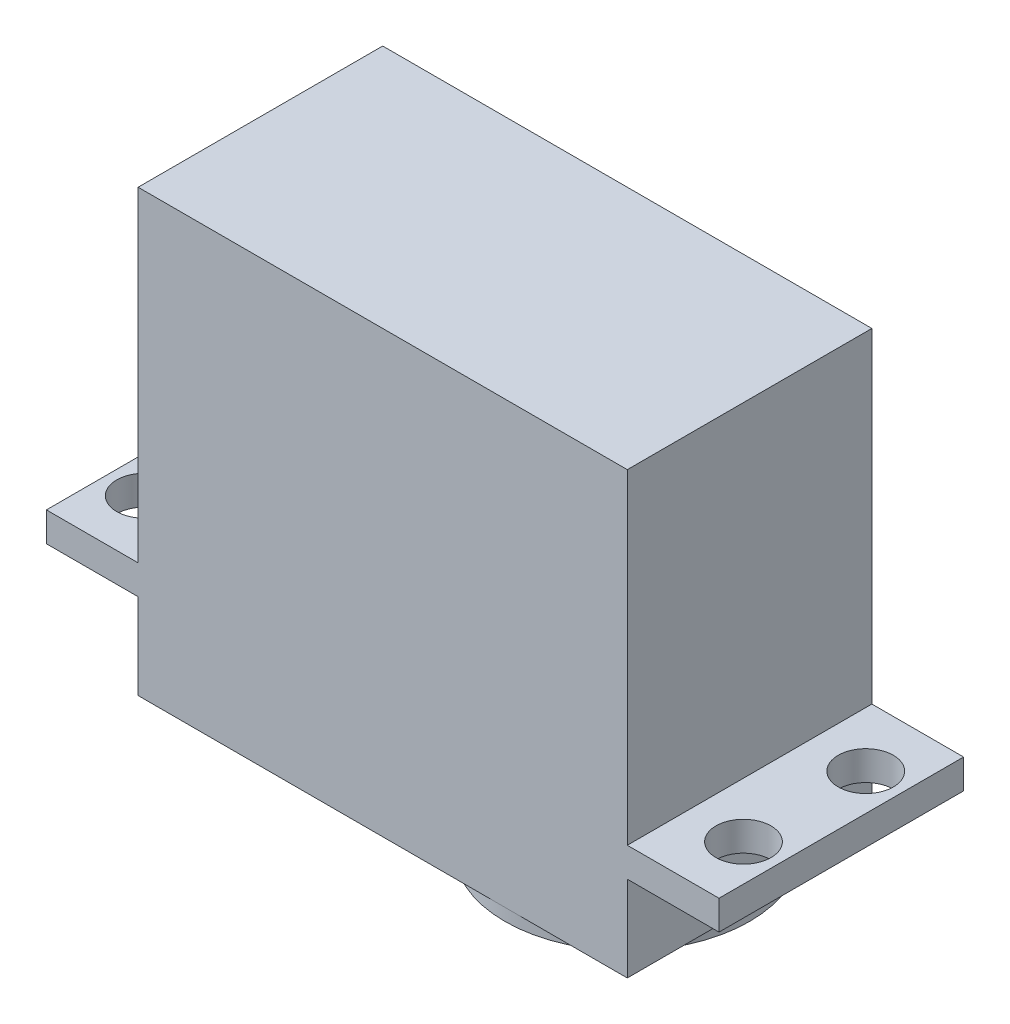
ISO-10303-21;
HEADER;
FILE_DESCRIPTION(('STEP AP214'),'2;1');
FILE_NAME('part.step','',(''),(''),'','','');
FILE_SCHEMA(('AUTOMOTIVE_DESIGN { 1 0 10303 214 1 1 1 1 }'));
ENDSEC;
DATA;
#1=APPLICATION_CONTEXT('core data for automotive mechanical design processes');
#2=APPLICATION_PROTOCOL_DEFINITION('international standard','automotive_design',2000,#1);
#3=PRODUCT_CONTEXT('',#1,'mechanical');
#4=PRODUCT('Part','Part','',(#3));
#5=PRODUCT_RELATED_PRODUCT_CATEGORY('part','',(#4));
#6=PRODUCT_DEFINITION_FORMATION('','',#4);
#7=PRODUCT_DEFINITION_CONTEXT('part definition',#1,'design');
#8=PRODUCT_DEFINITION('design','',#6,#7);
#9=PRODUCT_DEFINITION_SHAPE('','',#8);
#10=(LENGTH_UNIT() NAMED_UNIT(*) SI_UNIT(.MILLI.,.METRE.));
#11=(NAMED_UNIT(*) PLANE_ANGLE_UNIT() SI_UNIT($,.RADIAN.));
#12=(NAMED_UNIT(*) SI_UNIT($,.STERADIAN.) SOLID_ANGLE_UNIT());
#13=UNCERTAINTY_MEASURE_WITH_UNIT(LENGTH_MEASURE(1.E-05),#10,'distance_accuracy_value','');
#14=(GEOMETRIC_REPRESENTATION_CONTEXT(3) GLOBAL_UNCERTAINTY_ASSIGNED_CONTEXT((#13)) GLOBAL_UNIT_ASSIGNED_CONTEXT((#10,
#11,#12)) REPRESENTATION_CONTEXT('',''));
#15=CARTESIAN_POINT('',(0.,0.,0.));
#16=DIRECTION('',(0.,0.,1.));
#17=DIRECTION('',(1.,0.,0.));
#18=AXIS2_PLACEMENT_3D('',#15,#16,#17);
#19=CARTESIAN_POINT('',(0.,0.,0.));
#20=DIRECTION('',(0.,-1.,0.));
#21=DIRECTION('',(0.,0.,-1.));
#22=AXIS2_PLACEMENT_3D('',#19,#20,#21);
#23=PLANE('',#22);
#24=CARTESIAN_POINT('',(10.,0.,0.));
#25=DIRECTION('',(0.,-1.,0.));
#26=DIRECTION('',(0.,0.,-1.));
#27=AXIS2_PLACEMENT_3D('',#24,#25,#26);
#28=CIRCLE('',#27,10.);
#29=CARTESIAN_POINT('',(10.,0.,-10.));
#30=VERTEX_POINT('',#29);
#31=CARTESIAN_POINT('',(20.,0.,0.));
#32=VERTEX_POINT('',#31);
#33=EDGE_CURVE('E43',#30,#32,#28,.T.);
#34=ORIENTED_EDGE('',*,*,#33,.F.);
#35=DIRECTION('',(-1.,0.,0.));
#36=VECTOR('',#35,1.);
#37=CARTESIAN_POINT('',(-20.,0.,-10.));
#38=LINE('',#37,#36);
#39=CARTESIAN_POINT('',(20.,0.,-10.));
#40=VERTEX_POINT('',#39);
#41=EDGE_CURVE('E133',#40,#30,#38,.T.);
#42=ORIENTED_EDGE('',*,*,#41,.F.);
#43=DIRECTION('',(0.,0.,-1.));
#44=VECTOR('',#43,1.);
#45=CARTESIAN_POINT('',(20.,0.,10.));
#46=LINE('',#45,#44);
#47=EDGE_CURVE('E150',#32,#40,#46,.T.);
#48=ORIENTED_EDGE('',*,*,#47,.F.);
#49=EDGE_LOOP('',(#34,#42,#48));
#50=FACE_BOUND('',#49,.T.);
#51=ADVANCED_FACE('F32',(#50),#23,.T.);
#52=CARTESIAN_POINT('',(10.,0.,10.));
#53=VERTEX_POINT('',#52);
#54=EDGE_CURVE('E11',#32,#53,#28,.T.);
#55=ORIENTED_EDGE('',*,*,#54,.F.);
#56=CARTESIAN_POINT('',(20.,0.,10.));
#57=VERTEX_POINT('',#56);
#58=EDGE_CURVE('E148',#57,#32,#46,.T.);
#59=ORIENTED_EDGE('',*,*,#58,.F.);
#60=DIRECTION('',(1.,0.,0.));
#61=VECTOR('',#60,1.);
#62=CARTESIAN_POINT('',(-20.,0.,10.));
#63=LINE('',#62,#61);
#64=EDGE_CURVE('E240',#53,#57,#63,.T.);
#65=ORIENTED_EDGE('',*,*,#64,.F.);
#66=EDGE_LOOP('',(#55,#59,#65));
#67=FACE_BOUND('',#66,.T.);
#68=ADVANCED_FACE('F298',(#67),#23,.T.);
#69=CARTESIAN_POINT('',(20.,36.,10.));
#70=DIRECTION('',(-1.,0.,0.));
#71=DIRECTION('',(0.,0.,1.));
#72=AXIS2_PLACEMENT_3D('',#69,#70,#71);
#73=PLANE('',#72);
#74=DIRECTION('',(0.,0.,1.));
#75=VECTOR('',#74,1.);
#76=CARTESIAN_POINT('',(20.,9.4,10.));
#77=LINE('',#76,#75);
#78=CARTESIAN_POINT('',(20.,9.4,-10.));
#79=VERTEX_POINT('',#78);
#80=CARTESIAN_POINT('',(20.,9.4,10.));
#81=VERTEX_POINT('',#80);
#82=EDGE_CURVE('E225',#79,#81,#77,.T.);
#83=ORIENTED_EDGE('',*,*,#82,.F.);
#84=DIRECTION('',(0.,-1.,0.));
#85=VECTOR('',#84,1.);
#86=CARTESIAN_POINT('',(20.,36.,-10.));
#87=LINE('',#86,#85);
#88=CARTESIAN_POINT('',(20.,36.,-10.));
#89=VERTEX_POINT('',#88);
#90=EDGE_CURVE('E36',#89,#79,#87,.T.);
#91=ORIENTED_EDGE('',*,*,#90,.F.);
#92=DIRECTION('',(0.,0.,-1.));
#93=VECTOR('',#92,1.);
#94=CARTESIAN_POINT('',(20.,36.,10.));
#95=LINE('',#94,#93);
#96=CARTESIAN_POINT('',(20.,36.,10.));
#97=VERTEX_POINT('',#96);
#98=EDGE_CURVE('E227',#97,#89,#95,.T.);
#99=ORIENTED_EDGE('',*,*,#98,.F.);
#100=DIRECTION('',(0.,-1.,0.));
#101=VECTOR('',#100,1.);
#102=CARTESIAN_POINT('',(20.,36.,10.));
#103=LINE('',#102,#101);
#104=EDGE_CURVE('E243',#97,#81,#103,.T.);
#105=ORIENTED_EDGE('',*,*,#104,.T.);
#106=EDGE_LOOP('',(#83,#91,#99,#105));
#107=FACE_BOUND('',#106,.T.);
#108=ADVANCED_FACE('F286',(#107),#73,.F.);
#109=CARTESIAN_POINT('',(-20.,36.,10.));
#110=DIRECTION('',(1.,0.,0.));
#111=DIRECTION('',(0.,0.,-1.));
#112=AXIS2_PLACEMENT_3D('',#109,#110,#111);
#113=PLANE('',#112);
#114=DIRECTION('',(0.,0.,-1.));
#115=VECTOR('',#114,1.);
#116=CARTESIAN_POINT('',(-20.,9.4,10.));
#117=LINE('',#116,#115);
#118=CARTESIAN_POINT('',(-20.,9.4,10.));
#119=VERTEX_POINT('',#118);
#120=CARTESIAN_POINT('',(-20.,9.4,-10.));
#121=VERTEX_POINT('',#120);
#122=EDGE_CURVE('E223',#119,#121,#117,.T.);
#123=ORIENTED_EDGE('',*,*,#122,.F.);
#124=DIRECTION('',(0.,-1.,0.));
#125=VECTOR('',#124,1.);
#126=CARTESIAN_POINT('',(-20.,36.,10.));
#127=LINE('',#126,#125);
#128=CARTESIAN_POINT('',(-20.,36.,10.));
#129=VERTEX_POINT('',#128);
#130=EDGE_CURVE('E247',#129,#119,#127,.T.);
#131=ORIENTED_EDGE('',*,*,#130,.F.);
#132=DIRECTION('',(0.,0.,1.));
#133=VECTOR('',#132,1.);
#134=CARTESIAN_POINT('',(-20.,36.,10.));
#135=LINE('',#134,#133);
#136=CARTESIAN_POINT('',(-20.,36.,-10.));
#137=VERTEX_POINT('',#136);
#138=EDGE_CURVE('E233',#137,#129,#135,.T.);
#139=ORIENTED_EDGE('',*,*,#138,.F.);
#140=DIRECTION('',(0.,-1.,0.));
#141=VECTOR('',#140,1.);
#142=CARTESIAN_POINT('',(-20.,36.,-10.));
#143=LINE('',#142,#141);
#144=EDGE_CURVE('E250',#137,#121,#143,.T.);
#145=ORIENTED_EDGE('',*,*,#144,.T.);
#146=EDGE_LOOP('',(#123,#131,#139,#145));
#147=FACE_BOUND('',#146,.T.);
#148=ADVANCED_FACE('F277',(#147),#113,.F.);
#149=CARTESIAN_POINT('',(20.,7.,-10.));
#150=VERTEX_POINT('',#149);
#151=EDGE_CURVE('E140',#150,#40,#87,.T.);
#152=ORIENTED_EDGE('',*,*,#151,.F.);
#153=DIRECTION('',(0.,0.,1.));
#154=VECTOR('',#153,1.);
#155=CARTESIAN_POINT('',(20.,7.,10.));
#156=LINE('',#155,#154);
#157=CARTESIAN_POINT('',(20.,7.,10.));
#158=VERTEX_POINT('',#157);
#159=EDGE_CURVE('E220',#150,#158,#156,.T.);
#160=ORIENTED_EDGE('',*,*,#159,.T.);
#161=EDGE_CURVE('E237',#158,#57,#103,.T.);
#162=ORIENTED_EDGE('',*,*,#161,.T.);
#163=ORIENTED_EDGE('',*,*,#58,.T.);
#164=ORIENTED_EDGE('',*,*,#47,.T.);
#165=EDGE_LOOP('',(#152,#160,#162,#163,#164));
#166=FACE_BOUND('',#165,.T.);
#167=ADVANCED_FACE('F34',(#166),#73,.F.);
#168=CARTESIAN_POINT('',(-20.,36.,-10.));
#169=DIRECTION('',(0.,0.,1.));
#170=DIRECTION('',(1.,0.,0.));
#171=AXIS2_PLACEMENT_3D('',#168,#169,#170);
#172=PLANE('',#171);
#173=CARTESIAN_POINT('',(-20.,7.,-10.));
#174=VERTEX_POINT('',#173);
#175=CARTESIAN_POINT('',(-20.,0.,-10.));
#176=VERTEX_POINT('',#175);
#177=EDGE_CURVE('E249',#174,#176,#143,.T.);
#178=ORIENTED_EDGE('',*,*,#177,.F.);
#179=DIRECTION('',(-1.,0.,0.));
#180=VECTOR('',#179,1.);
#181=CARTESIAN_POINT('',(-27.5,7.,-10.));
#182=LINE('',#181,#180);
#183=CARTESIAN_POINT('',(-27.5,7.,-10.));
#184=VERTEX_POINT('',#183);
#185=EDGE_CURVE('E198',#174,#184,#182,.T.);
#186=ORIENTED_EDGE('',*,*,#185,.T.);
#187=DIRECTION('',(0.,-1.,0.));
#188=VECTOR('',#187,1.);
#189=CARTESIAN_POINT('',(-27.5,9.4,-10.));
#190=LINE('',#189,#188);
#191=CARTESIAN_POINT('',(-27.5,9.4,-10.));
#192=VERTEX_POINT('',#191);
#193=EDGE_CURVE('E211',#192,#184,#190,.T.);
#194=ORIENTED_EDGE('',*,*,#193,.F.);
#195=DIRECTION('',(-1.,0.,0.));
#196=VECTOR('',#195,1.);
#197=CARTESIAN_POINT('',(-27.5,9.4,-10.));
#198=LINE('',#197,#196);
#199=EDGE_CURVE('E186',#121,#192,#198,.T.);
#200=ORIENTED_EDGE('',*,*,#199,.F.);
#201=ORIENTED_EDGE('',*,*,#144,.F.);
#202=DIRECTION('',(-1.,0.,0.));
#203=VECTOR('',#202,1.);
#204=CARTESIAN_POINT('',(-20.,36.,-10.));
#205=LINE('',#204,#203);
#206=EDGE_CURVE('E230',#89,#137,#205,.T.);
#207=ORIENTED_EDGE('',*,*,#206,.F.);
#208=ORIENTED_EDGE('',*,*,#90,.T.);
#209=CARTESIAN_POINT('',(27.5,9.4,-10.));
#210=VERTEX_POINT('',#209);
#211=EDGE_CURVE('E188',#210,#79,#198,.T.);
#212=ORIENTED_EDGE('',*,*,#211,.F.);
#213=DIRECTION('',(0.,-1.,0.));
#214=VECTOR('',#213,1.);
#215=CARTESIAN_POINT('',(27.5,9.4,-10.));
#216=LINE('',#215,#214);
#217=CARTESIAN_POINT('',(27.5,7.,-10.));
#218=VERTEX_POINT('',#217);
#219=EDGE_CURVE('E214',#210,#218,#216,.T.);
#220=ORIENTED_EDGE('',*,*,#219,.T.);
#221=EDGE_CURVE('E199',#218,#150,#182,.T.);
#222=ORIENTED_EDGE('',*,*,#221,.T.);
#223=ORIENTED_EDGE('',*,*,#151,.T.);
#224=ORIENTED_EDGE('',*,*,#41,.T.);
#225=EDGE_CURVE('E136',#30,#176,#38,.T.);
#226=ORIENTED_EDGE('',*,*,#225,.T.);
#227=EDGE_LOOP('',(#178,#186,#194,#200,#201,#207,#208,#212,#220,#222,#223,#224,#226));
#228=FACE_BOUND('',#227,.T.);
#229=ADVANCED_FACE('F135',(#228),#172,.F.);
#230=CARTESIAN_POINT('',(-20.,7.,10.));
#231=VERTEX_POINT('',#230);
#232=CARTESIAN_POINT('',(-20.,0.,10.));
#233=VERTEX_POINT('',#232);
#234=EDGE_CURVE('E246',#231,#233,#127,.T.);
#235=ORIENTED_EDGE('',*,*,#234,.F.);
#236=DIRECTION('',(0.,0.,-1.));
#237=VECTOR('',#236,1.);
#238=CARTESIAN_POINT('',(-20.,7.,10.));
#239=LINE('',#238,#237);
#240=EDGE_CURVE('E217',#231,#174,#239,.T.);
#241=ORIENTED_EDGE('',*,*,#240,.T.);
#242=ORIENTED_EDGE('',*,*,#177,.T.);
#243=DIRECTION('',(0.,0.,1.));
#244=VECTOR('',#243,1.);
#245=CARTESIAN_POINT('',(-20.,0.,10.));
#246=LINE('',#245,#244);
#247=EDGE_CURVE('E143',#176,#233,#246,.T.);
#248=ORIENTED_EDGE('',*,*,#247,.T.);
#249=EDGE_LOOP('',(#235,#241,#242,#248));
#250=FACE_BOUND('',#249,.T.);
#251=ADVANCED_FACE('F258',(#250),#113,.F.);
#252=CARTESIAN_POINT('',(-20.,36.,10.));
#253=DIRECTION('',(0.,0.,-1.));
#254=DIRECTION('',(-1.,0.,0.));
#255=AXIS2_PLACEMENT_3D('',#252,#253,#254);
#256=PLANE('',#255);
#257=ORIENTED_EDGE('',*,*,#161,.F.);
#258=DIRECTION('',(1.,0.,0.));
#259=VECTOR('',#258,1.);
#260=CARTESIAN_POINT('',(-27.5,7.,10.));
#261=LINE('',#260,#259);
#262=CARTESIAN_POINT('',(27.5,7.,10.));
#263=VERTEX_POINT('',#262);
#264=EDGE_CURVE('E203',#158,#263,#261,.T.);
#265=ORIENTED_EDGE('',*,*,#264,.T.);
#266=DIRECTION('',(0.,-1.,0.));
#267=VECTOR('',#266,1.);
#268=CARTESIAN_POINT('',(27.5,9.4,10.));
#269=LINE('',#268,#267);
#270=CARTESIAN_POINT('',(27.5,9.4,10.));
#271=VERTEX_POINT('',#270);
#272=EDGE_CURVE('E195',#271,#263,#269,.T.);
#273=ORIENTED_EDGE('',*,*,#272,.F.);
#274=DIRECTION('',(1.,0.,0.));
#275=VECTOR('',#274,1.);
#276=CARTESIAN_POINT('',(-27.5,9.4,10.));
#277=LINE('',#276,#275);
#278=EDGE_CURVE('E192',#81,#271,#277,.T.);
#279=ORIENTED_EDGE('',*,*,#278,.F.);
#280=ORIENTED_EDGE('',*,*,#104,.F.);
#281=DIRECTION('',(1.,0.,0.));
#282=VECTOR('',#281,1.);
#283=CARTESIAN_POINT('',(-20.,36.,10.));
#284=LINE('',#283,#282);
#285=EDGE_CURVE('E235',#129,#97,#284,.T.);
#286=ORIENTED_EDGE('',*,*,#285,.F.);
#287=ORIENTED_EDGE('',*,*,#130,.T.);
#288=CARTESIAN_POINT('',(-27.5,9.4,10.));
#289=VERTEX_POINT('',#288);
#290=EDGE_CURVE('E193',#289,#119,#277,.T.);
#291=ORIENTED_EDGE('',*,*,#290,.F.);
#292=DIRECTION('',(0.,-1.,0.));
#293=VECTOR('',#292,1.);
#294=CARTESIAN_POINT('',(-27.5,9.4,10.));
#295=LINE('',#294,#293);
#296=CARTESIAN_POINT('',(-27.5,7.,10.));
#297=VERTEX_POINT('',#296);
#298=EDGE_CURVE('E208',#289,#297,#295,.T.);
#299=ORIENTED_EDGE('',*,*,#298,.T.);
#300=EDGE_CURVE('E187',#297,#231,#261,.T.);
#301=ORIENTED_EDGE('',*,*,#300,.T.);
#302=ORIENTED_EDGE('',*,*,#234,.T.);
#303=EDGE_CURVE('E231',#233,#53,#63,.T.);
#304=ORIENTED_EDGE('',*,*,#303,.T.);
#305=ORIENTED_EDGE('',*,*,#64,.T.);
#306=EDGE_LOOP('',(#257,#265,#273,#279,#280,#286,#287,#291,#299,#301,#302,#304,#305));
#307=FACE_BOUND('',#306,.T.);
#308=ADVANCED_FACE('F271',(#307),#256,.F.);
#309=CARTESIAN_POINT('',(0.,36.,0.));
#310=DIRECTION('',(0.,-1.,0.));
#311=DIRECTION('',(0.,0.,-1.));
#312=AXIS2_PLACEMENT_3D('',#309,#310,#311);
#313=PLANE('',#312);
#314=ORIENTED_EDGE('',*,*,#98,.T.);
#315=ORIENTED_EDGE('',*,*,#206,.T.);
#316=ORIENTED_EDGE('',*,*,#138,.T.);
#317=ORIENTED_EDGE('',*,*,#285,.T.);
#318=EDGE_LOOP('',(#314,#315,#316,#317));
#319=FACE_BOUND('',#318,.T.);
#320=ADVANCED_FACE('F282',(#319),#313,.F.);
#321=EDGE_CURVE('E41',#53,#30,#28,.T.);
#322=ORIENTED_EDGE('',*,*,#321,.F.);
#323=ORIENTED_EDGE('',*,*,#303,.F.);
#324=ORIENTED_EDGE('',*,*,#247,.F.);
#325=ORIENTED_EDGE('',*,*,#225,.F.);
#326=EDGE_LOOP('',(#322,#323,#324,#325));
#327=FACE_BOUND('',#326,.T.);
#328=ADVANCED_FACE('F146',(#327),#23,.T.);
#329=CARTESIAN_POINT('',(-27.5,9.4,10.));
#330=DIRECTION('',(1.,0.,0.));
#331=DIRECTION('',(0.,0.,-1.));
#332=AXIS2_PLACEMENT_3D('',#329,#330,#331);
#333=PLANE('',#332);
#334=DIRECTION('',(0.,0.,1.));
#335=VECTOR('',#334,1.);
#336=CARTESIAN_POINT('',(-27.5,7.,10.));
#337=LINE('',#336,#335);
#338=EDGE_CURVE('E201',#184,#297,#337,.T.);
#339=ORIENTED_EDGE('',*,*,#338,.T.);
#340=ORIENTED_EDGE('',*,*,#298,.F.);
#341=DIRECTION('',(0.,0.,1.));
#342=VECTOR('',#341,1.);
#343=CARTESIAN_POINT('',(-27.5,9.4,10.));
#344=LINE('',#343,#342);
#345=EDGE_CURVE('E190',#192,#289,#344,.T.);
#346=ORIENTED_EDGE('',*,*,#345,.F.);
#347=ORIENTED_EDGE('',*,*,#193,.T.);
#348=EDGE_LOOP('',(#339,#340,#346,#347));
#349=FACE_BOUND('',#348,.T.);
#350=ADVANCED_FACE('F265',(#349),#333,.F.);
#351=CARTESIAN_POINT('',(0.,9.4,0.));
#352=DIRECTION('',(0.,-1.,0.));
#353=DIRECTION('',(0.,0.,-1.));
#354=AXIS2_PLACEMENT_3D('',#351,#352,#353);
#355=PLANE('',#354);
#356=CARTESIAN_POINT('',(-24.5,9.4,-5.));
#357=DIRECTION('',(0.,-1.,0.));
#358=DIRECTION('',(0.,0.,-1.));
#359=AXIS2_PLACEMENT_3D('',#356,#357,#358);
#360=CIRCLE('',#359,2.24999999999999);
#361=CARTESIAN_POINT('',(-24.5,9.4,-7.24999999999999));
#362=VERTEX_POINT('',#361);
#363=EDGE_CURVE('E161',#362,#362,#360,.T.);
#364=ORIENTED_EDGE('',*,*,#363,.T.);
#365=EDGE_LOOP('',(#364));
#366=FACE_BOUND('',#365,.T.);
#367=CARTESIAN_POINT('',(-24.5,9.4,5.));
#368=DIRECTION('',(0.,-1.,0.));
#369=DIRECTION('',(0.,0.,-1.));
#370=AXIS2_PLACEMENT_3D('',#367,#368,#369);
#371=CIRCLE('',#370,2.24999999999999);
#372=CARTESIAN_POINT('',(-24.5,9.4,2.75000000000001));
#373=VERTEX_POINT('',#372);
#374=EDGE_CURVE('E167',#373,#373,#371,.T.);
#375=ORIENTED_EDGE('',*,*,#374,.T.);
#376=EDGE_LOOP('',(#375));
#377=FACE_BOUND('',#376,.T.);
#378=ORIENTED_EDGE('',*,*,#290,.T.);
#379=ORIENTED_EDGE('',*,*,#122,.T.);
#380=ORIENTED_EDGE('',*,*,#199,.T.);
#381=ORIENTED_EDGE('',*,*,#345,.T.);
#382=EDGE_LOOP('',(#378,#379,#380,#381));
#383=FACE_BOUND('',#382,.T.);
#384=ADVANCED_FACE('F276',(#366,#377,#383),#355,.F.);
#385=CARTESIAN_POINT('',(0.,7.,0.));
#386=DIRECTION('',(0.,-1.,0.));
#387=DIRECTION('',(0.,0.,-1.));
#388=AXIS2_PLACEMENT_3D('',#385,#386,#387);
#389=PLANE('',#388);
#390=CARTESIAN_POINT('',(-24.5,6.99999999999999,-5.));
#391=DIRECTION('',(0.,-1.,0.));
#392=DIRECTION('',(0.,0.,-1.));
#393=AXIS2_PLACEMENT_3D('',#390,#391,#392);
#394=CIRCLE('',#393,2.24999999999999);
#395=CARTESIAN_POINT('',(-24.5,6.99999999999999,-7.24999999999999));
#396=VERTEX_POINT('',#395);
#397=EDGE_CURVE('E158',#396,#396,#394,.T.);
#398=ORIENTED_EDGE('',*,*,#397,.F.);
#399=EDGE_LOOP('',(#398));
#400=FACE_BOUND('',#399,.T.);
#401=CARTESIAN_POINT('',(-24.5,6.99999999999999,5.));
#402=DIRECTION('',(0.,-1.,0.));
#403=DIRECTION('',(0.,0.,-1.));
#404=AXIS2_PLACEMENT_3D('',#401,#402,#403);
#405=CIRCLE('',#404,2.24999999999999);
#406=CARTESIAN_POINT('',(-24.5,6.99999999999999,2.75000000000001));
#407=VERTEX_POINT('',#406);
#408=EDGE_CURVE('E164',#407,#407,#405,.T.);
#409=ORIENTED_EDGE('',*,*,#408,.F.);
#410=EDGE_LOOP('',(#409));
#411=FACE_BOUND('',#410,.T.);
#412=ORIENTED_EDGE('',*,*,#240,.F.);
#413=ORIENTED_EDGE('',*,*,#300,.F.);
#414=ORIENTED_EDGE('',*,*,#338,.F.);
#415=ORIENTED_EDGE('',*,*,#185,.F.);
#416=EDGE_LOOP('',(#412,#413,#414,#415));
#417=FACE_BOUND('',#416,.T.);
#418=ADVANCED_FACE('F268',(#400,#411,#417),#389,.T.);
#419=CARTESIAN_POINT('',(24.5,9.4,-5.));
#420=DIRECTION('',(0.,-1.,0.));
#421=DIRECTION('',(0.,0.,-1.));
#422=AXIS2_PLACEMENT_3D('',#419,#420,#421);
#423=CIRCLE('',#422,2.24999999999999);
#424=CARTESIAN_POINT('',(24.5,9.4,-7.24999999999999));
#425=VERTEX_POINT('',#424);
#426=EDGE_CURVE('E173',#425,#425,#423,.T.);
#427=ORIENTED_EDGE('',*,*,#426,.T.);
#428=EDGE_LOOP('',(#427));
#429=FACE_BOUND('',#428,.T.);
#430=CARTESIAN_POINT('',(24.5,9.4,5.));
#431=DIRECTION('',(0.,-1.,0.));
#432=DIRECTION('',(0.,0.,-1.));
#433=AXIS2_PLACEMENT_3D('',#430,#431,#432);
#434=CIRCLE('',#433,2.24999999999999);
#435=CARTESIAN_POINT('',(24.5,9.4,2.75000000000001));
#436=VERTEX_POINT('',#435);
#437=EDGE_CURVE('E179',#436,#436,#434,.T.);
#438=ORIENTED_EDGE('',*,*,#437,.T.);
#439=EDGE_LOOP('',(#438));
#440=FACE_BOUND('',#439,.T.);
#441=ORIENTED_EDGE('',*,*,#211,.T.);
#442=ORIENTED_EDGE('',*,*,#82,.T.);
#443=ORIENTED_EDGE('',*,*,#278,.T.);
#444=DIRECTION('',(0.,0.,-1.));
#445=VECTOR('',#444,1.);
#446=CARTESIAN_POINT('',(27.5,9.4,10.));
#447=LINE('',#446,#445);
#448=EDGE_CURVE('E183',#271,#210,#447,.T.);
#449=ORIENTED_EDGE('',*,*,#448,.T.);
#450=EDGE_LOOP('',(#441,#442,#443,#449));
#451=FACE_BOUND('',#450,.T.);
#452=ADVANCED_FACE('F288',(#429,#440,#451),#355,.F.);
#453=CARTESIAN_POINT('',(24.5,6.99999999999999,-5.));
#454=DIRECTION('',(0.,-1.,0.));
#455=DIRECTION('',(0.,0.,-1.));
#456=AXIS2_PLACEMENT_3D('',#453,#454,#455);
#457=CIRCLE('',#456,2.24999999999999);
#458=CARTESIAN_POINT('',(24.5,6.99999999999999,-7.24999999999999));
#459=VERTEX_POINT('',#458);
#460=EDGE_CURVE('E170',#459,#459,#457,.T.);
#461=ORIENTED_EDGE('',*,*,#460,.F.);
#462=EDGE_LOOP('',(#461));
#463=FACE_BOUND('',#462,.T.);
#464=CARTESIAN_POINT('',(24.5,6.99999999999999,5.));
#465=DIRECTION('',(0.,-1.,0.));
#466=DIRECTION('',(0.,0.,-1.));
#467=AXIS2_PLACEMENT_3D('',#464,#465,#466);
#468=CIRCLE('',#467,2.24999999999999);
#469=CARTESIAN_POINT('',(24.5,6.99999999999999,2.75000000000001));
#470=VERTEX_POINT('',#469);
#471=EDGE_CURVE('E176',#470,#470,#468,.T.);
#472=ORIENTED_EDGE('',*,*,#471,.F.);
#473=EDGE_LOOP('',(#472));
#474=FACE_BOUND('',#473,.T.);
#475=ORIENTED_EDGE('',*,*,#159,.F.);
#476=ORIENTED_EDGE('',*,*,#221,.F.);
#477=DIRECTION('',(0.,0.,-1.));
#478=VECTOR('',#477,1.);
#479=CARTESIAN_POINT('',(27.5,7.,10.));
#480=LINE('',#479,#478);
#481=EDGE_CURVE('E182',#263,#218,#480,.T.);
#482=ORIENTED_EDGE('',*,*,#481,.F.);
#483=ORIENTED_EDGE('',*,*,#264,.F.);
#484=EDGE_LOOP('',(#475,#476,#482,#483));
#485=FACE_BOUND('',#484,.T.);
#486=ADVANCED_FACE('F319',(#463,#474,#485),#389,.T.);
#487=CARTESIAN_POINT('',(27.5,9.4,10.));
#488=DIRECTION('',(-1.,0.,0.));
#489=DIRECTION('',(0.,0.,1.));
#490=AXIS2_PLACEMENT_3D('',#487,#488,#489);
#491=PLANE('',#490);
#492=ORIENTED_EDGE('',*,*,#481,.T.);
#493=ORIENTED_EDGE('',*,*,#219,.F.);
#494=ORIENTED_EDGE('',*,*,#448,.F.);
#495=ORIENTED_EDGE('',*,*,#272,.T.);
#496=EDGE_LOOP('',(#492,#493,#494,#495));
#497=FACE_BOUND('',#496,.T.);
#498=ADVANCED_FACE('F294',(#497),#491,.F.);
#499=CARTESIAN_POINT('',(24.5,7.,5.));
#500=DIRECTION('',(0.,-1.,0.));
#501=DIRECTION('',(0.,0.,-1.));
#502=AXIS2_PLACEMENT_3D('',#499,#500,#501);
#503=CYLINDRICAL_SURFACE('',#502,2.24999999999999);
#504=ORIENTED_EDGE('',*,*,#471,.T.);
#505=EDGE_LOOP('',(#504));
#506=FACE_BOUND('',#505,.T.);
#507=ORIENTED_EDGE('',*,*,#437,.F.);
#508=EDGE_LOOP('',(#507));
#509=FACE_BOUND('',#508,.T.);
#510=ADVANCED_FACE('F318',(#506,#509),#503,.F.);
#511=CARTESIAN_POINT('',(24.5,7.,-5.));
#512=DIRECTION('',(0.,-1.,0.));
#513=DIRECTION('',(0.,0.,-1.));
#514=AXIS2_PLACEMENT_3D('',#511,#512,#513);
#515=CYLINDRICAL_SURFACE('',#514,2.24999999999999);
#516=ORIENTED_EDGE('',*,*,#460,.T.);
#517=EDGE_LOOP('',(#516));
#518=FACE_BOUND('',#517,.T.);
#519=ORIENTED_EDGE('',*,*,#426,.F.);
#520=EDGE_LOOP('',(#519));
#521=FACE_BOUND('',#520,.T.);
#522=ADVANCED_FACE('F329',(#518,#521),#515,.F.);
#523=CARTESIAN_POINT('',(-24.5,7.,5.));
#524=DIRECTION('',(0.,-1.,0.));
#525=DIRECTION('',(0.,0.,-1.));
#526=AXIS2_PLACEMENT_3D('',#523,#524,#525);
#527=CYLINDRICAL_SURFACE('',#526,2.24999999999999);
#528=ORIENTED_EDGE('',*,*,#408,.T.);
#529=EDGE_LOOP('',(#528));
#530=FACE_BOUND('',#529,.T.);
#531=ORIENTED_EDGE('',*,*,#374,.F.);
#532=EDGE_LOOP('',(#531));
#533=FACE_BOUND('',#532,.T.);
#534=ADVANCED_FACE('F333',(#530,#533),#527,.F.);
#535=CARTESIAN_POINT('',(-24.5,7.,-5.));
#536=DIRECTION('',(0.,-1.,0.));
#537=DIRECTION('',(0.,0.,-1.));
#538=AXIS2_PLACEMENT_3D('',#535,#536,#537);
#539=CYLINDRICAL_SURFACE('',#538,2.24999999999999);
#540=ORIENTED_EDGE('',*,*,#397,.T.);
#541=EDGE_LOOP('',(#540));
#542=FACE_BOUND('',#541,.T.);
#543=ORIENTED_EDGE('',*,*,#363,.F.);
#544=EDGE_LOOP('',(#543));
#545=FACE_BOUND('',#544,.T.);
#546=ADVANCED_FACE('F337',(#542,#545),#539,.F.);
#547=CARTESIAN_POINT('',(10.,-1.,0.));
#548=DIRECTION('',(0.,1.,0.));
#549=DIRECTION('',(0.,0.,1.));
#550=AXIS2_PLACEMENT_3D('',#547,#548,#549);
#551=CYLINDRICAL_SURFACE('',#550,10.);
#552=CARTESIAN_POINT('',(10.,-1.,0.));
#553=DIRECTION('',(0.,-1.,0.));
#554=DIRECTION('',(0.,0.,-1.));
#555=AXIS2_PLACEMENT_3D('',#552,#553,#554);
#556=CIRCLE('',#555,10.);
#557=CARTESIAN_POINT('',(10.,-1.,-10.));
#558=VERTEX_POINT('',#557);
#559=EDGE_CURVE('E153',#558,#558,#556,.T.);
#560=ORIENTED_EDGE('',*,*,#559,.F.);
#561=EDGE_LOOP('',(#560));
#562=FACE_BOUND('',#561,.T.);
#563=ORIENTED_EDGE('',*,*,#33,.T.);
#564=ORIENTED_EDGE('',*,*,#54,.T.);
#565=ORIENTED_EDGE('',*,*,#321,.T.);
#566=EDGE_LOOP('',(#563,#564,#565));
#567=FACE_BOUND('',#566,.T.);
#568=ADVANCED_FACE('F154',(#562,#567),#551,.T.);
#569=CARTESIAN_POINT('',(10.,-1.,0.));
#570=DIRECTION('',(0.,-1.,0.));
#571=DIRECTION('',(0.,0.,-1.));
#572=AXIS2_PLACEMENT_3D('',#569,#570,#571);
#573=PLANE('',#572);
#574=ORIENTED_EDGE('',*,*,#559,.T.);
#575=EDGE_LOOP('',(#574));
#576=FACE_BOUND('',#575,.T.);
#577=ADVANCED_FACE('F344',(#576),#573,.T.);
#578=CLOSED_SHELL('',(#51,#68,#108,#148,#167,#229,#251,#308,#320,#328,#350,#384,#418,#452,#486,
#498,#510,#522,#534,#546,#568,#577));
#579=MANIFOLD_SOLID_BREP('B2',#578);
#580=ADVANCED_BREP_SHAPE_REPRESENTATION('',(#18,#579),#14);
#581=SHAPE_DEFINITION_REPRESENTATION(#9,#580);
ENDSEC;
END-ISO-10303-21;
